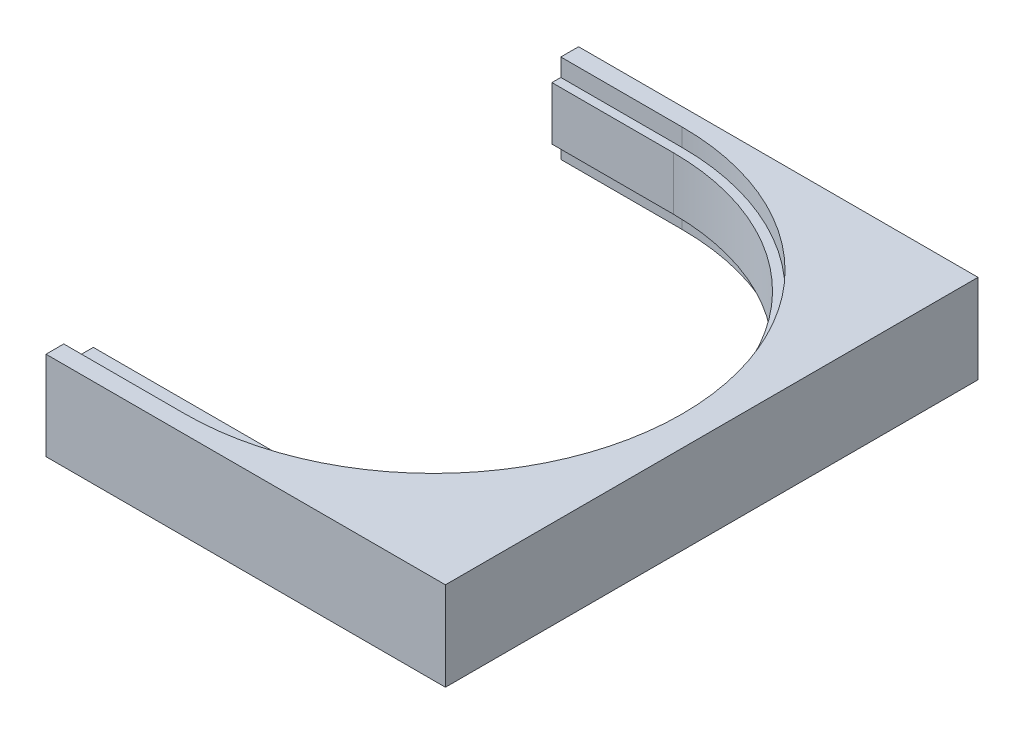
ISO-10303-21;
HEADER;
FILE_DESCRIPTION(('STEP AP214'),'2;1');
FILE_NAME('part.step','',(''),(''),'','','');
FILE_SCHEMA(('AUTOMOTIVE_DESIGN { 1 0 10303 214 1 1 1 1 }'));
ENDSEC;
DATA;
#1=APPLICATION_CONTEXT('core data for automotive mechanical design processes');
#2=APPLICATION_PROTOCOL_DEFINITION('international standard','automotive_design',2000,#1);
#3=PRODUCT_CONTEXT('',#1,'mechanical');
#4=PRODUCT('Part','Part','',(#3));
#5=PRODUCT_RELATED_PRODUCT_CATEGORY('part','',(#4));
#6=PRODUCT_DEFINITION_FORMATION('','',#4);
#7=PRODUCT_DEFINITION_CONTEXT('part definition',#1,'design');
#8=PRODUCT_DEFINITION('design','',#6,#7);
#9=PRODUCT_DEFINITION_SHAPE('','',#8);
#10=(LENGTH_UNIT() NAMED_UNIT(*) SI_UNIT(.MILLI.,.METRE.));
#11=(NAMED_UNIT(*) PLANE_ANGLE_UNIT() SI_UNIT($,.RADIAN.));
#12=(NAMED_UNIT(*) SI_UNIT($,.STERADIAN.) SOLID_ANGLE_UNIT());
#13=UNCERTAINTY_MEASURE_WITH_UNIT(LENGTH_MEASURE(1.E-05),#10,'distance_accuracy_value','');
#14=(GEOMETRIC_REPRESENTATION_CONTEXT(3) GLOBAL_UNCERTAINTY_ASSIGNED_CONTEXT((#13)) GLOBAL_UNIT_ASSIGNED_CONTEXT((#10,
#11,#12)) REPRESENTATION_CONTEXT('',''));
#15=CARTESIAN_POINT('',(0.,0.,0.));
#16=DIRECTION('',(0.,0.,1.));
#17=DIRECTION('',(1.,0.,0.));
#18=AXIS2_PLACEMENT_3D('',#15,#16,#17);
#19=CARTESIAN_POINT('',(0.,3.81,-44.196));
#20=DIRECTION('',(0.,0.,-1.));
#21=DIRECTION('',(-1.,0.,0.));
#22=AXIS2_PLACEMENT_3D('',#19,#20,#21);
#23=PLANE('',#22);
#24=DIRECTION('',(-1.,0.,0.));
#25=VECTOR('',#24,1.);
#26=CARTESIAN_POINT('',(0.,2.286,-44.196));
#27=LINE('',#26,#25);
#28=CARTESIAN_POINT('',(10.414,2.286,-44.196));
#29=VERTEX_POINT('',#28);
#30=CARTESIAN_POINT('',(0.,2.286,-44.196));
#31=VERTEX_POINT('',#30);
#32=EDGE_CURVE('E132',#29,#31,#27,.T.);
#33=ORIENTED_EDGE('',*,*,#32,.F.);
#34=DIRECTION('',(0.,-1.,0.));
#35=VECTOR('',#34,1.);
#36=CARTESIAN_POINT('',(10.414,3.81,-44.196));
#37=LINE('',#36,#35);
#38=CARTESIAN_POINT('',(10.414,3.81,-44.196));
#39=VERTEX_POINT('',#38);
#40=EDGE_CURVE('E129',#39,#29,#37,.T.);
#41=ORIENTED_EDGE('',*,*,#40,.F.);
#42=DIRECTION('',(1.,0.,0.));
#43=VECTOR('',#42,1.);
#44=CARTESIAN_POINT('',(0.,3.81,-44.196));
#45=LINE('',#44,#43);
#46=CARTESIAN_POINT('',(0.,3.81,-44.196));
#47=VERTEX_POINT('',#46);
#48=EDGE_CURVE('E115',#47,#39,#45,.T.);
#49=ORIENTED_EDGE('',*,*,#48,.F.);
#50=DIRECTION('',(0.,-1.,0.));
#51=VECTOR('',#50,1.);
#52=CARTESIAN_POINT('',(0.,3.81,-44.196));
#53=LINE('',#52,#51);
#54=EDGE_CURVE('E171',#47,#31,#53,.T.);
#55=ORIENTED_EDGE('',*,*,#54,.T.);
#56=EDGE_LOOP('',(#33,#41,#49,#55));
#57=FACE_BOUND('',#56,.T.);
#58=ADVANCED_FACE('F33',(#57),#23,.F.);
#59=CARTESIAN_POINT('',(10.414,3.81,-22.86));
#60=DIRECTION('',(0.,-1.,0.));
#61=DIRECTION('',(0.,0.,-1.));
#62=AXIS2_PLACEMENT_3D('',#59,#60,#61);
#63=CYLINDRICAL_SURFACE('',#62,21.336);
#64=CARTESIAN_POINT('',(10.414,2.286,-22.86));
#65=DIRECTION('',(0.,1.,0.));
#66=DIRECTION('',(0.,0.,-1.));
#67=AXIS2_PLACEMENT_3D('',#64,#65,#66);
#68=CIRCLE('',#67,21.336);
#69=CARTESIAN_POINT('',(10.414,2.286,-1.524));
#70=VERTEX_POINT('',#69);
#71=EDGE_CURVE('E250',#70,#29,#68,.T.);
#72=ORIENTED_EDGE('',*,*,#71,.F.);
#73=DIRECTION('',(0.,-1.,0.));
#74=VECTOR('',#73,1.);
#75=CARTESIAN_POINT('',(10.414,3.81,-1.524));
#76=LINE('',#75,#74);
#77=CARTESIAN_POINT('',(10.414,3.81,-1.524));
#78=VERTEX_POINT('',#77);
#79=EDGE_CURVE('E140',#78,#70,#76,.T.);
#80=ORIENTED_EDGE('',*,*,#79,.F.);
#81=CARTESIAN_POINT('',(10.414,3.81,-22.86));
#82=DIRECTION('',(0.,-1.,0.));
#83=DIRECTION('',(0.,0.,-1.));
#84=AXIS2_PLACEMENT_3D('',#81,#82,#83);
#85=CIRCLE('',#84,21.336);
#86=EDGE_CURVE('E119',#39,#78,#85,.T.);
#87=ORIENTED_EDGE('',*,*,#86,.F.);
#88=ORIENTED_EDGE('',*,*,#40,.T.);
#89=EDGE_LOOP('',(#72,#80,#87,#88));
#90=FACE_BOUND('',#89,.T.);
#91=ADVANCED_FACE('F138',(#90),#63,.F.);
#92=CARTESIAN_POINT('',(0.,3.81,-1.524));
#93=DIRECTION('',(0.,0.,1.));
#94=DIRECTION('',(1.,0.,0.));
#95=AXIS2_PLACEMENT_3D('',#92,#93,#94);
#96=PLANE('',#95);
#97=DIRECTION('',(1.,0.,0.));
#98=VECTOR('',#97,1.);
#99=CARTESIAN_POINT('',(0.,2.286,-1.524));
#100=LINE('',#99,#98);
#101=CARTESIAN_POINT('',(0.,2.286,-1.524));
#102=VERTEX_POINT('',#101);
#103=EDGE_CURVE('E253',#102,#70,#100,.T.);
#104=ORIENTED_EDGE('',*,*,#103,.F.);
#105=DIRECTION('',(0.,-1.,0.));
#106=VECTOR('',#105,1.);
#107=CARTESIAN_POINT('',(0.,3.81,-1.524));
#108=LINE('',#107,#106);
#109=CARTESIAN_POINT('',(0.,3.81,-1.524));
#110=VERTEX_POINT('',#109);
#111=EDGE_CURVE('E166',#110,#102,#108,.T.);
#112=ORIENTED_EDGE('',*,*,#111,.F.);
#113=DIRECTION('',(-1.,0.,0.));
#114=VECTOR('',#113,1.);
#115=CARTESIAN_POINT('',(0.,3.81,-1.524));
#116=LINE('',#115,#114);
#117=EDGE_CURVE('E57',#78,#110,#116,.T.);
#118=ORIENTED_EDGE('',*,*,#117,.F.);
#119=ORIENTED_EDGE('',*,*,#79,.T.);
#120=EDGE_LOOP('',(#104,#112,#118,#119));
#121=FACE_BOUND('',#120,.T.);
#122=ADVANCED_FACE('F267',(#121),#96,.F.);
#123=CARTESIAN_POINT('',(0.,3.81,0.));
#124=DIRECTION('',(1.,0.,0.));
#125=DIRECTION('',(0.,0.,-1.));
#126=AXIS2_PLACEMENT_3D('',#123,#124,#125);
#127=PLANE('',#126);
#128=DIRECTION('',(0.,0.,1.));
#129=VECTOR('',#128,1.);
#130=CARTESIAN_POINT('',(0.,-3.81,0.));
#131=LINE('',#130,#129);
#132=CARTESIAN_POINT('',(0.,-3.81,-1.524));
#133=VERTEX_POINT('',#132);
#134=CARTESIAN_POINT('',(0.,-3.81,0.));
#135=VERTEX_POINT('',#134);
#136=EDGE_CURVE('E145',#133,#135,#131,.T.);
#137=ORIENTED_EDGE('',*,*,#136,.T.);
#138=DIRECTION('',(0.,-1.,0.));
#139=VECTOR('',#138,1.);
#140=CARTESIAN_POINT('',(0.,3.81,0.));
#141=LINE('',#140,#139);
#142=CARTESIAN_POINT('',(0.,3.81,0.));
#143=VERTEX_POINT('',#142);
#144=EDGE_CURVE('E11',#143,#135,#141,.T.);
#145=ORIENTED_EDGE('',*,*,#144,.F.);
#146=DIRECTION('',(0.,0.,1.));
#147=VECTOR('',#146,1.);
#148=CARTESIAN_POINT('',(0.,3.81,0.));
#149=LINE('',#148,#147);
#150=EDGE_CURVE('E165',#110,#143,#149,.T.);
#151=ORIENTED_EDGE('',*,*,#150,.F.);
#152=ORIENTED_EDGE('',*,*,#111,.T.);
#153=DIRECTION('',(0.,0.,1.));
#154=VECTOR('',#153,1.);
#155=CARTESIAN_POINT('',(0.,2.286,-4.06400000000001));
#156=LINE('',#155,#154);
#157=CARTESIAN_POINT('',(0.,2.286,-4.06400000000001));
#158=VERTEX_POINT('',#157);
#159=EDGE_CURVE('E220',#158,#102,#156,.T.);
#160=ORIENTED_EDGE('',*,*,#159,.F.);
#161=DIRECTION('',(0.,-1.,0.));
#162=VECTOR('',#161,1.);
#163=CARTESIAN_POINT('',(0.,2.286,-4.06400000000001));
#164=LINE('',#163,#162);
#165=CARTESIAN_POINT('',(0.,-2.286,-4.06400000000001));
#166=VERTEX_POINT('',#165);
#167=EDGE_CURVE('E213',#158,#166,#164,.T.);
#168=ORIENTED_EDGE('',*,*,#167,.T.);
#169=DIRECTION('',(0.,0.,1.));
#170=VECTOR('',#169,1.);
#171=CARTESIAN_POINT('',(0.,-2.286,-4.06400000000001));
#172=LINE('',#171,#170);
#173=CARTESIAN_POINT('',(0.,-2.286,-1.524));
#174=VERTEX_POINT('',#173);
#175=EDGE_CURVE('E236',#166,#174,#172,.T.);
#176=ORIENTED_EDGE('',*,*,#175,.T.);
#177=EDGE_CURVE('E91',#174,#133,#108,.T.);
#178=ORIENTED_EDGE('',*,*,#177,.T.);
#179=EDGE_LOOP('',(#137,#145,#151,#152,#160,#168,#176,#178));
#180=FACE_BOUND('',#179,.T.);
#181=ADVANCED_FACE('F35',(#180),#127,.F.);
#182=CARTESIAN_POINT('',(0.,3.81,0.));
#183=DIRECTION('',(0.,0.,-1.));
#184=DIRECTION('',(-1.,0.,0.));
#185=AXIS2_PLACEMENT_3D('',#182,#183,#184);
#186=PLANE('',#185);
#187=DIRECTION('',(1.,0.,0.));
#188=VECTOR('',#187,1.);
#189=CARTESIAN_POINT('',(0.,-3.81,0.));
#190=LINE('',#189,#188);
#191=CARTESIAN_POINT('',(34.29,-3.81,0.));
#192=VERTEX_POINT('',#191);
#193=EDGE_CURVE('E147',#135,#192,#190,.T.);
#194=ORIENTED_EDGE('',*,*,#193,.T.);
#195=DIRECTION('',(0.,-1.,0.));
#196=VECTOR('',#195,1.);
#197=CARTESIAN_POINT('',(34.29,3.81,0.));
#198=LINE('',#197,#196);
#199=CARTESIAN_POINT('',(34.29,3.81,0.));
#200=VERTEX_POINT('',#199);
#201=EDGE_CURVE('E41',#200,#192,#198,.T.);
#202=ORIENTED_EDGE('',*,*,#201,.F.);
#203=DIRECTION('',(1.,0.,0.));
#204=VECTOR('',#203,1.);
#205=CARTESIAN_POINT('',(0.,3.81,0.));
#206=LINE('',#205,#204);
#207=EDGE_CURVE('E99',#143,#200,#206,.T.);
#208=ORIENTED_EDGE('',*,*,#207,.F.);
#209=ORIENTED_EDGE('',*,*,#144,.T.);
#210=EDGE_LOOP('',(#194,#202,#208,#209));
#211=FACE_BOUND('',#210,.T.);
#212=ADVANCED_FACE('F270',(#211),#186,.F.);
#213=CARTESIAN_POINT('',(34.29,3.81,0.));
#214=DIRECTION('',(-1.,0.,0.));
#215=DIRECTION('',(0.,0.,1.));
#216=AXIS2_PLACEMENT_3D('',#213,#214,#215);
#217=PLANE('',#216);
#218=DIRECTION('',(0.,0.,-1.));
#219=VECTOR('',#218,1.);
#220=CARTESIAN_POINT('',(34.29,-3.81,0.));
#221=LINE('',#220,#219);
#222=CARTESIAN_POINT('',(34.29,-3.81,-45.72));
#223=VERTEX_POINT('',#222);
#224=EDGE_CURVE('E150',#192,#223,#221,.T.);
#225=ORIENTED_EDGE('',*,*,#224,.T.);
#226=DIRECTION('',(0.,-1.,0.));
#227=VECTOR('',#226,1.);
#228=CARTESIAN_POINT('',(34.29,3.81,-45.72));
#229=LINE('',#228,#227);
#230=CARTESIAN_POINT('',(34.29,3.81,-45.72));
#231=VERTEX_POINT('',#230);
#232=EDGE_CURVE('E176',#231,#223,#229,.T.);
#233=ORIENTED_EDGE('',*,*,#232,.F.);
#234=DIRECTION('',(0.,0.,-1.));
#235=VECTOR('',#234,1.);
#236=CARTESIAN_POINT('',(34.29,3.81,0.));
#237=LINE('',#236,#235);
#238=EDGE_CURVE('E184',#200,#231,#237,.T.);
#239=ORIENTED_EDGE('',*,*,#238,.F.);
#240=ORIENTED_EDGE('',*,*,#201,.T.);
#241=EDGE_LOOP('',(#225,#233,#239,#240));
#242=FACE_BOUND('',#241,.T.);
#243=ADVANCED_FACE('F182',(#242),#217,.F.);
#244=CARTESIAN_POINT('',(0.,3.81,-45.72));
#245=DIRECTION('',(0.,0.,1.));
#246=DIRECTION('',(1.,0.,0.));
#247=AXIS2_PLACEMENT_3D('',#244,#245,#246);
#248=PLANE('',#247);
#249=DIRECTION('',(-1.,0.,0.));
#250=VECTOR('',#249,1.);
#251=CARTESIAN_POINT('',(0.,-3.81,-45.72));
#252=LINE('',#251,#250);
#253=CARTESIAN_POINT('',(0.,-3.81,-45.72));
#254=VERTEX_POINT('',#253);
#255=EDGE_CURVE('E152',#223,#254,#252,.T.);
#256=ORIENTED_EDGE('',*,*,#255,.T.);
#257=DIRECTION('',(0.,-1.,0.));
#258=VECTOR('',#257,1.);
#259=CARTESIAN_POINT('',(0.,3.81,-45.72));
#260=LINE('',#259,#258);
#261=CARTESIAN_POINT('',(0.,3.81,-45.72));
#262=VERTEX_POINT('',#261);
#263=EDGE_CURVE('E173',#262,#254,#260,.T.);
#264=ORIENTED_EDGE('',*,*,#263,.F.);
#265=DIRECTION('',(-1.,0.,0.));
#266=VECTOR('',#265,1.);
#267=CARTESIAN_POINT('',(0.,3.81,-45.72));
#268=LINE('',#267,#266);
#269=EDGE_CURVE('E199',#231,#262,#268,.T.);
#270=ORIENTED_EDGE('',*,*,#269,.F.);
#271=ORIENTED_EDGE('',*,*,#232,.T.);
#272=EDGE_LOOP('',(#256,#264,#270,#271));
#273=FACE_BOUND('',#272,.T.);
#274=ADVANCED_FACE('F193',(#273),#248,.F.);
#275=CARTESIAN_POINT('',(0.,3.81,-45.72));
#276=DIRECTION('',(1.,0.,0.));
#277=DIRECTION('',(0.,0.,-1.));
#278=AXIS2_PLACEMENT_3D('',#275,#276,#277);
#279=PLANE('',#278);
#280=DIRECTION('',(0.,0.,1.));
#281=VECTOR('',#280,1.);
#282=CARTESIAN_POINT('',(0.,-3.81,-45.72));
#283=LINE('',#282,#281);
#284=CARTESIAN_POINT('',(0.,-3.81,-44.196));
#285=VERTEX_POINT('',#284);
#286=EDGE_CURVE('E154',#254,#285,#283,.T.);
#287=ORIENTED_EDGE('',*,*,#286,.T.);
#288=CARTESIAN_POINT('',(0.,-2.286,-44.196));
#289=VERTEX_POINT('',#288);
#290=EDGE_CURVE('E135',#289,#285,#53,.T.);
#291=ORIENTED_EDGE('',*,*,#290,.F.);
#292=DIRECTION('',(0.,0.,1.));
#293=VECTOR('',#292,1.);
#294=CARTESIAN_POINT('',(0.,-2.286,-43.434));
#295=LINE('',#294,#293);
#296=CARTESIAN_POINT('',(0.,-2.286,-43.434));
#297=VERTEX_POINT('',#296);
#298=EDGE_CURVE('E227',#289,#297,#295,.T.);
#299=ORIENTED_EDGE('',*,*,#298,.T.);
#300=DIRECTION('',(0.,-1.,0.));
#301=VECTOR('',#300,1.);
#302=CARTESIAN_POINT('',(0.,2.286,-43.434));
#303=LINE('',#302,#301);
#304=CARTESIAN_POINT('',(0.,2.286,-43.434));
#305=VERTEX_POINT('',#304);
#306=EDGE_CURVE('E148',#305,#297,#303,.T.);
#307=ORIENTED_EDGE('',*,*,#306,.F.);
#308=DIRECTION('',(0.,0.,1.));
#309=VECTOR('',#308,1.);
#310=CARTESIAN_POINT('',(0.,2.286,-43.434));
#311=LINE('',#310,#309);
#312=EDGE_CURVE('E246',#31,#305,#311,.T.);
#313=ORIENTED_EDGE('',*,*,#312,.F.);
#314=ORIENTED_EDGE('',*,*,#54,.F.);
#315=DIRECTION('',(0.,0.,1.));
#316=VECTOR('',#315,1.);
#317=CARTESIAN_POINT('',(0.,3.81,-45.72));
#318=LINE('',#317,#316);
#319=EDGE_CURVE('E122',#262,#47,#318,.T.);
#320=ORIENTED_EDGE('',*,*,#319,.F.);
#321=ORIENTED_EDGE('',*,*,#263,.T.);
#322=EDGE_LOOP('',(#287,#291,#299,#307,#313,#314,#320,#321));
#323=FACE_BOUND('',#322,.T.);
#324=ADVANCED_FACE('F196',(#323),#279,.F.);
#325=CARTESIAN_POINT('',(10.414,-2.286,-44.196));
#326=VERTEX_POINT('',#325);
#327=CARTESIAN_POINT('',(10.414,-3.81,-44.196));
#328=VERTEX_POINT('',#327);
#329=EDGE_CURVE('E136',#326,#328,#37,.T.);
#330=ORIENTED_EDGE('',*,*,#329,.F.);
#331=DIRECTION('',(-1.,0.,0.));
#332=VECTOR('',#331,1.);
#333=CARTESIAN_POINT('',(0.,-2.286,-44.196));
#334=LINE('',#333,#332);
#335=EDGE_CURVE('E230',#326,#289,#334,.T.);
#336=ORIENTED_EDGE('',*,*,#335,.T.);
#337=ORIENTED_EDGE('',*,*,#290,.T.);
#338=DIRECTION('',(1.,0.,0.));
#339=VECTOR('',#338,1.);
#340=CARTESIAN_POINT('',(0.,-3.81,-44.196));
#341=LINE('',#340,#339);
#342=EDGE_CURVE('E157',#285,#328,#341,.T.);
#343=ORIENTED_EDGE('',*,*,#342,.T.);
#344=EDGE_LOOP('',(#330,#336,#337,#343));
#345=FACE_BOUND('',#344,.T.);
#346=ADVANCED_FACE('F279',(#345),#23,.F.);
#347=CARTESIAN_POINT('',(10.414,-2.286,-1.524));
#348=VERTEX_POINT('',#347);
#349=CARTESIAN_POINT('',(10.414,-3.81,-1.524));
#350=VERTEX_POINT('',#349);
#351=EDGE_CURVE('E169',#348,#350,#76,.T.);
#352=ORIENTED_EDGE('',*,*,#351,.F.);
#353=CARTESIAN_POINT('',(10.414,-2.286,-22.86));
#354=DIRECTION('',(0.,1.,0.));
#355=DIRECTION('',(0.,0.,-1.));
#356=AXIS2_PLACEMENT_3D('',#353,#354,#355);
#357=CIRCLE('',#356,21.336);
#358=EDGE_CURVE('E48',#348,#326,#357,.T.);
#359=ORIENTED_EDGE('',*,*,#358,.T.);
#360=ORIENTED_EDGE('',*,*,#329,.T.);
#361=CARTESIAN_POINT('',(10.414,-3.81,-22.86));
#362=DIRECTION('',(0.,-1.,0.));
#363=DIRECTION('',(0.,0.,-1.));
#364=AXIS2_PLACEMENT_3D('',#361,#362,#363);
#365=CIRCLE('',#364,21.336);
#366=EDGE_CURVE('E160',#328,#350,#365,.T.);
#367=ORIENTED_EDGE('',*,*,#366,.T.);
#368=EDGE_LOOP('',(#352,#359,#360,#367));
#369=FACE_BOUND('',#368,.T.);
#370=ADVANCED_FACE('F284',(#369),#63,.F.);
#371=ORIENTED_EDGE('',*,*,#177,.F.);
#372=DIRECTION('',(1.,0.,0.));
#373=VECTOR('',#372,1.);
#374=CARTESIAN_POINT('',(0.,-2.286,-1.524));
#375=LINE('',#374,#373);
#376=EDGE_CURVE('E234',#174,#348,#375,.T.);
#377=ORIENTED_EDGE('',*,*,#376,.T.);
#378=ORIENTED_EDGE('',*,*,#351,.T.);
#379=DIRECTION('',(-1.,0.,0.));
#380=VECTOR('',#379,1.);
#381=CARTESIAN_POINT('',(0.,-3.81,-1.524));
#382=LINE('',#381,#380);
#383=EDGE_CURVE('E163',#350,#133,#382,.T.);
#384=ORIENTED_EDGE('',*,*,#383,.T.);
#385=EDGE_LOOP('',(#371,#377,#378,#384));
#386=FACE_BOUND('',#385,.T.);
#387=ADVANCED_FACE('F292',(#386),#96,.F.);
#388=CARTESIAN_POINT('',(10.414,3.81,-22.86));
#389=DIRECTION('',(0.,-1.,0.));
#390=DIRECTION('',(0.,0.,-1.));
#391=AXIS2_PLACEMENT_3D('',#388,#389,#390);
#392=PLANE('',#391);
#393=ORIENTED_EDGE('',*,*,#150,.T.);
#394=ORIENTED_EDGE('',*,*,#207,.T.);
#395=ORIENTED_EDGE('',*,*,#238,.T.);
#396=ORIENTED_EDGE('',*,*,#269,.T.);
#397=ORIENTED_EDGE('',*,*,#319,.T.);
#398=ORIENTED_EDGE('',*,*,#48,.T.);
#399=ORIENTED_EDGE('',*,*,#86,.T.);
#400=ORIENTED_EDGE('',*,*,#117,.T.);
#401=EDGE_LOOP('',(#393,#394,#395,#396,#397,#398,#399,#400));
#402=FACE_BOUND('',#401,.T.);
#403=ADVANCED_FACE('F117',(#402),#392,.F.);
#404=CARTESIAN_POINT('',(10.414,-3.81,-22.86));
#405=DIRECTION('',(0.,-1.,0.));
#406=DIRECTION('',(0.,0.,-1.));
#407=AXIS2_PLACEMENT_3D('',#404,#405,#406);
#408=PLANE('',#407);
#409=ORIENTED_EDGE('',*,*,#136,.F.);
#410=ORIENTED_EDGE('',*,*,#383,.F.);
#411=ORIENTED_EDGE('',*,*,#366,.F.);
#412=ORIENTED_EDGE('',*,*,#342,.F.);
#413=ORIENTED_EDGE('',*,*,#286,.F.);
#414=ORIENTED_EDGE('',*,*,#255,.F.);
#415=ORIENTED_EDGE('',*,*,#224,.F.);
#416=ORIENTED_EDGE('',*,*,#193,.F.);
#417=EDGE_LOOP('',(#409,#410,#411,#412,#413,#414,#415,#416));
#418=FACE_BOUND('',#417,.T.);
#419=ADVANCED_FACE('F188',(#418),#408,.T.);
#420=CARTESIAN_POINT('',(0.,2.286,-43.434));
#421=DIRECTION('',(0.,0.,-1.));
#422=DIRECTION('',(-1.,0.,0.));
#423=AXIS2_PLACEMENT_3D('',#420,#421,#422);
#424=PLANE('',#423);
#425=DIRECTION('',(1.,0.,0.));
#426=VECTOR('',#425,1.);
#427=CARTESIAN_POINT('',(0.,-2.286,-43.434));
#428=LINE('',#427,#426);
#429=CARTESIAN_POINT('',(10.414,-2.286,-43.434));
#430=VERTEX_POINT('',#429);
#431=EDGE_CURVE('E224',#297,#430,#428,.T.);
#432=ORIENTED_EDGE('',*,*,#431,.T.);
#433=DIRECTION('',(0.,-1.,0.));
#434=VECTOR('',#433,1.);
#435=CARTESIAN_POINT('',(10.414,2.286,-43.434));
#436=LINE('',#435,#434);
#437=CARTESIAN_POINT('',(10.414,2.286,-43.434));
#438=VERTEX_POINT('',#437);
#439=EDGE_CURVE('E207',#438,#430,#436,.T.);
#440=ORIENTED_EDGE('',*,*,#439,.F.);
#441=DIRECTION('',(1.,0.,0.));
#442=VECTOR('',#441,1.);
#443=CARTESIAN_POINT('',(0.,2.286,-43.434));
#444=LINE('',#443,#442);
#445=EDGE_CURVE('E243',#305,#438,#444,.T.);
#446=ORIENTED_EDGE('',*,*,#445,.F.);
#447=ORIENTED_EDGE('',*,*,#306,.T.);
#448=EDGE_LOOP('',(#432,#440,#446,#447));
#449=FACE_BOUND('',#448,.T.);
#450=ADVANCED_FACE('F329',(#449),#424,.F.);
#451=CARTESIAN_POINT('',(10.414,2.286,-22.86));
#452=DIRECTION('',(0.,-1.,0.));
#453=DIRECTION('',(0.,0.,-1.));
#454=AXIS2_PLACEMENT_3D('',#451,#452,#453);
#455=CYLINDRICAL_SURFACE('',#454,20.574);
#456=CARTESIAN_POINT('',(10.414,-2.286,-22.86));
#457=DIRECTION('',(0.,-1.,0.));
#458=DIRECTION('',(0.,0.,-1.));
#459=AXIS2_PLACEMENT_3D('',#456,#457,#458);
#460=CIRCLE('',#459,20.574);
#461=CARTESIAN_POINT('',(18.7805918987363,-2.286,-4.06400000000001));
#462=VERTEX_POINT('',#461);
#463=EDGE_CURVE('E221',#430,#462,#460,.T.);
#464=ORIENTED_EDGE('',*,*,#463,.T.);
#465=DIRECTION('',(0.,-1.,0.));
#466=VECTOR('',#465,1.);
#467=CARTESIAN_POINT('',(18.7805918987363,2.286,-4.06400000000001));
#468=LINE('',#467,#466);
#469=CARTESIAN_POINT('',(18.7805918987363,2.286,-4.06400000000001));
#470=VERTEX_POINT('',#469);
#471=EDGE_CURVE('E210',#470,#462,#468,.T.);
#472=ORIENTED_EDGE('',*,*,#471,.F.);
#473=CARTESIAN_POINT('',(10.414,2.286,-22.86));
#474=DIRECTION('',(0.,-1.,0.));
#475=DIRECTION('',(0.,0.,-1.));
#476=AXIS2_PLACEMENT_3D('',#473,#474,#475);
#477=CIRCLE('',#476,20.574);
#478=EDGE_CURVE('E240',#438,#470,#477,.T.);
#479=ORIENTED_EDGE('',*,*,#478,.F.);
#480=ORIENTED_EDGE('',*,*,#439,.T.);
#481=EDGE_LOOP('',(#464,#472,#479,#480));
#482=FACE_BOUND('',#481,.T.);
#483=ADVANCED_FACE('F324',(#482),#455,.F.);
#484=CARTESIAN_POINT('',(0.,2.286,-4.06400000000001));
#485=DIRECTION('',(0.,0.,1.));
#486=DIRECTION('',(1.,0.,0.));
#487=AXIS2_PLACEMENT_3D('',#484,#485,#486);
#488=PLANE('',#487);
#489=DIRECTION('',(-1.,0.,0.));
#490=VECTOR('',#489,1.);
#491=CARTESIAN_POINT('',(0.,-2.286,-4.06400000000001));
#492=LINE('',#491,#490);
#493=EDGE_CURVE('E217',#462,#166,#492,.T.);
#494=ORIENTED_EDGE('',*,*,#493,.T.);
#495=ORIENTED_EDGE('',*,*,#167,.F.);
#496=DIRECTION('',(-1.,0.,0.));
#497=VECTOR('',#496,1.);
#498=CARTESIAN_POINT('',(0.,2.286,-4.06400000000001));
#499=LINE('',#498,#497);
#500=EDGE_CURVE('E216',#470,#158,#499,.T.);
#501=ORIENTED_EDGE('',*,*,#500,.F.);
#502=ORIENTED_EDGE('',*,*,#471,.T.);
#503=EDGE_LOOP('',(#494,#495,#501,#502));
#504=FACE_BOUND('',#503,.T.);
#505=ADVANCED_FACE('F309',(#504),#488,.F.);
#506=CARTESIAN_POINT('',(10.414,2.286,-22.86));
#507=DIRECTION('',(0.,-1.,0.));
#508=DIRECTION('',(0.,0.,-1.));
#509=AXIS2_PLACEMENT_3D('',#506,#507,#508);
#510=PLANE('',#509);
#511=ORIENTED_EDGE('',*,*,#159,.T.);
#512=ORIENTED_EDGE('',*,*,#103,.T.);
#513=ORIENTED_EDGE('',*,*,#71,.T.);
#514=ORIENTED_EDGE('',*,*,#32,.T.);
#515=ORIENTED_EDGE('',*,*,#312,.T.);
#516=ORIENTED_EDGE('',*,*,#445,.T.);
#517=ORIENTED_EDGE('',*,*,#478,.T.);
#518=ORIENTED_EDGE('',*,*,#500,.T.);
#519=EDGE_LOOP('',(#511,#512,#513,#514,#515,#516,#517,#518));
#520=FACE_BOUND('',#519,.T.);
#521=ADVANCED_FACE('F261',(#520),#510,.F.);
#522=CARTESIAN_POINT('',(10.414,-2.286,-22.86));
#523=DIRECTION('',(0.,-1.,0.));
#524=DIRECTION('',(0.,0.,-1.));
#525=AXIS2_PLACEMENT_3D('',#522,#523,#524);
#526=PLANE('',#525);
#527=ORIENTED_EDGE('',*,*,#175,.F.);
#528=ORIENTED_EDGE('',*,*,#493,.F.);
#529=ORIENTED_EDGE('',*,*,#463,.F.);
#530=ORIENTED_EDGE('',*,*,#431,.F.);
#531=ORIENTED_EDGE('',*,*,#298,.F.);
#532=ORIENTED_EDGE('',*,*,#335,.F.);
#533=ORIENTED_EDGE('',*,*,#358,.F.);
#534=ORIENTED_EDGE('',*,*,#376,.F.);
#535=EDGE_LOOP('',(#527,#528,#529,#530,#531,#532,#533,#534));
#536=FACE_BOUND('',#535,.T.);
#537=ADVANCED_FACE('F304',(#536),#526,.T.);
#538=CLOSED_SHELL('',(#58,#91,#122,#181,#212,#243,#274,#324,#346,#370,#387,#403,#419,#450,#483,
#505,#521,#537));
#539=MANIFOLD_SOLID_BREP('B2',#538);
#540=ADVANCED_BREP_SHAPE_REPRESENTATION('',(#18,#539),#14);
#541=SHAPE_DEFINITION_REPRESENTATION(#9,#540);
ENDSEC;
END-ISO-10303-21;
